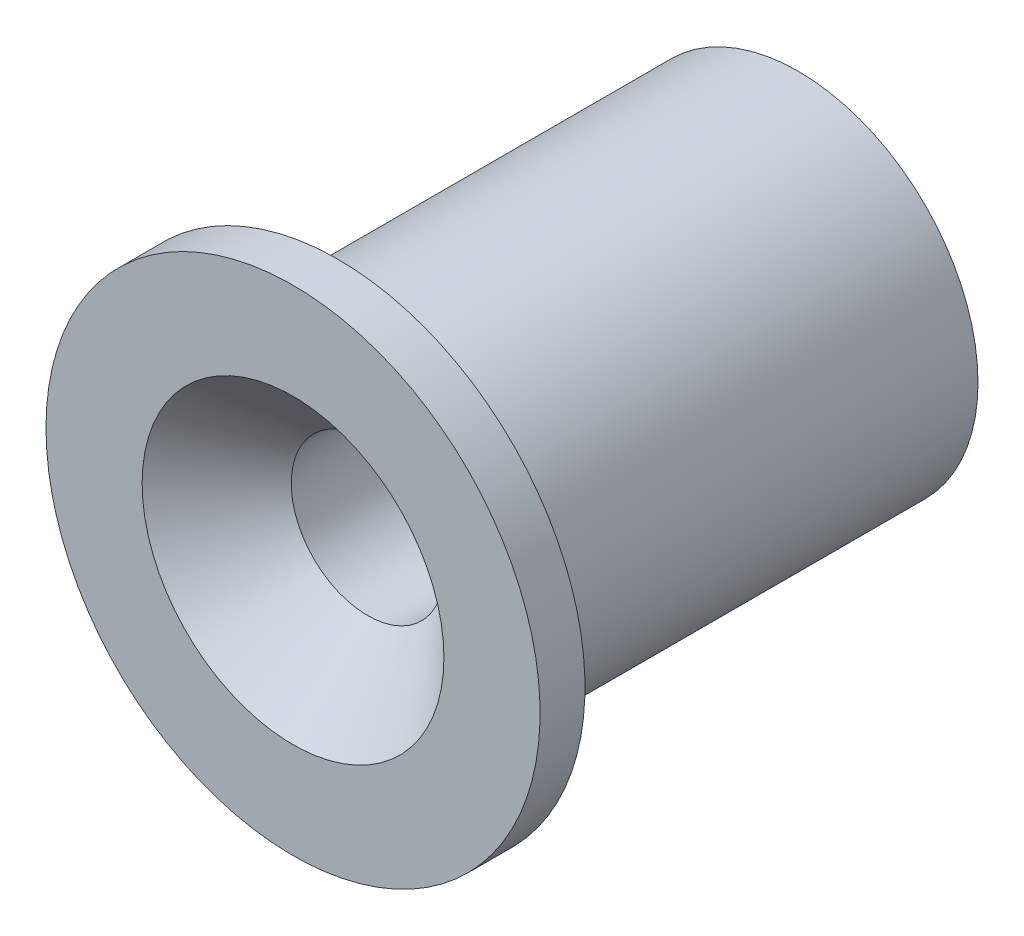
ISO-10303-21;
HEADER;
FILE_DESCRIPTION(('STEP AP214'),'2;1');
FILE_NAME('part.step','',(''),(''),'','','');
FILE_SCHEMA(('AUTOMOTIVE_DESIGN { 1 0 10303 214 1 1 1 1 }'));
ENDSEC;
DATA;
#1=APPLICATION_CONTEXT('core data for automotive mechanical design processes');
#2=APPLICATION_PROTOCOL_DEFINITION('international standard','automotive_design',2000,#1);
#3=PRODUCT_CONTEXT('',#1,'mechanical');
#4=PRODUCT('Part','Part','',(#3));
#5=PRODUCT_RELATED_PRODUCT_CATEGORY('part','',(#4));
#6=PRODUCT_DEFINITION_FORMATION('','',#4);
#7=PRODUCT_DEFINITION_CONTEXT('part definition',#1,'design');
#8=PRODUCT_DEFINITION('design','',#6,#7);
#9=PRODUCT_DEFINITION_SHAPE('','',#8);
#10=(LENGTH_UNIT() NAMED_UNIT(*) SI_UNIT(.MILLI.,.METRE.));
#11=(NAMED_UNIT(*) PLANE_ANGLE_UNIT() SI_UNIT($,.RADIAN.));
#12=(NAMED_UNIT(*) SI_UNIT($,.STERADIAN.) SOLID_ANGLE_UNIT());
#13=UNCERTAINTY_MEASURE_WITH_UNIT(LENGTH_MEASURE(1.E-05),#10,'distance_accuracy_value','');
#14=(GEOMETRIC_REPRESENTATION_CONTEXT(3) GLOBAL_UNCERTAINTY_ASSIGNED_CONTEXT((#13)) GLOBAL_UNIT_ASSIGNED_CONTEXT((#10,
#11,#12)) REPRESENTATION_CONTEXT('',''));
#15=CARTESIAN_POINT('',(0.,0.,0.));
#16=DIRECTION('',(0.,0.,1.));
#17=DIRECTION('',(1.,0.,0.));
#18=AXIS2_PLACEMENT_3D('',#15,#16,#17);
#19=CARTESIAN_POINT('',(-4.,0.,-11.25));
#20=DIRECTION('',(0.,0.,-1.));
#21=DIRECTION('',(-1.,0.,0.));
#22=AXIS2_PLACEMENT_3D('',#19,#20,#21);
#23=PLANE('',#22);
#24=CARTESIAN_POINT('',(0.,0.,-11.25));
#25=DIRECTION('',(0.,0.,1.));
#26=DIRECTION('',(1.,0.,0.));
#27=AXIS2_PLACEMENT_3D('',#24,#25,#26);
#28=CIRCLE('',#27,1.7);
#29=CARTESIAN_POINT('',(1.7,0.,-11.25));
#30=VERTEX_POINT('',#29);
#31=EDGE_CURVE('E49',#30,#30,#28,.T.);
#32=ORIENTED_EDGE('',*,*,#31,.T.);
#33=EDGE_LOOP('',(#32));
#34=FACE_BOUND('',#33,.T.);
#35=CARTESIAN_POINT('',(0.,0.,-11.25));
#36=DIRECTION('',(0.,0.,-1.));
#37=DIRECTION('',(-1.,0.,0.));
#38=AXIS2_PLACEMENT_3D('',#35,#36,#37);
#39=CIRCLE('',#38,4.);
#40=CARTESIAN_POINT('',(-4.,0.,-11.25));
#41=VERTEX_POINT('',#40);
#42=EDGE_CURVE('E44',#41,#41,#39,.T.);
#43=ORIENTED_EDGE('',*,*,#42,.T.);
#44=EDGE_LOOP('',(#43));
#45=FACE_BOUND('',#44,.T.);
#46=ADVANCED_FACE('F30',(#34,#45),#23,.T.);
#47=CARTESIAN_POINT('',(-1.5,0.,0.));
#48=DIRECTION('',(0.,0.,1.));
#49=DIRECTION('',(1.,0.,0.));
#50=AXIS2_PLACEMENT_3D('',#47,#48,#49);
#51=PLANE('',#50);
#52=CARTESIAN_POINT('',(0.,0.,0.));
#53=DIRECTION('',(0.,0.,1.));
#54=DIRECTION('',(1.,0.,0.));
#55=AXIS2_PLACEMENT_3D('',#52,#53,#54);
#56=CIRCLE('',#55,3.36);
#57=CARTESIAN_POINT('',(3.36,0.,0.));
#58=VERTEX_POINT('',#57);
#59=EDGE_CURVE('E55',#58,#58,#56,.T.);
#60=ORIENTED_EDGE('',*,*,#59,.F.);
#61=EDGE_LOOP('',(#60));
#62=FACE_BOUND('',#61,.T.);
#63=CARTESIAN_POINT('',(0.,0.,0.));
#64=DIRECTION('',(0.,0.,-1.));
#65=DIRECTION('',(-1.,0.,0.));
#66=AXIS2_PLACEMENT_3D('',#63,#64,#65);
#67=CIRCLE('',#66,5.5);
#68=CARTESIAN_POINT('',(-5.5,0.,0.));
#69=VERTEX_POINT('',#68);
#70=EDGE_CURVE('E10',#69,#69,#67,.T.);
#71=ORIENTED_EDGE('',*,*,#70,.F.);
#72=EDGE_LOOP('',(#71));
#73=FACE_BOUND('',#72,.T.);
#74=ADVANCED_FACE('F61',(#62,#73),#51,.T.);
#75=CARTESIAN_POINT('',(0.,0.,-19.1421319796954));
#76=DIRECTION('',(0.,0.,-1.));
#77=DIRECTION('',(-1.,0.,0.));
#78=AXIS2_PLACEMENT_3D('',#75,#76,#77);
#79=CYLINDRICAL_SURFACE('',#78,5.5);
#80=ORIENTED_EDGE('',*,*,#70,.T.);
#81=EDGE_LOOP('',(#80));
#82=FACE_BOUND('',#81,.T.);
#83=CARTESIAN_POINT('',(0.,0.,-1.));
#84=DIRECTION('',(0.,0.,-1.));
#85=DIRECTION('',(-1.,0.,0.));
#86=AXIS2_PLACEMENT_3D('',#83,#84,#85);
#87=CIRCLE('',#86,5.5);
#88=CARTESIAN_POINT('',(-5.5,0.,-1.));
#89=VERTEX_POINT('',#88);
#90=EDGE_CURVE('E36',#89,#89,#87,.T.);
#91=ORIENTED_EDGE('',*,*,#90,.F.);
#92=EDGE_LOOP('',(#91));
#93=FACE_BOUND('',#92,.T.);
#94=ADVANCED_FACE('F64',(#82,#93),#79,.T.);
#95=CARTESIAN_POINT('',(-5.5,0.,-1.));
#96=DIRECTION('',(0.,0.,-1.));
#97=DIRECTION('',(-1.,0.,0.));
#98=AXIS2_PLACEMENT_3D('',#95,#96,#97);
#99=PLANE('',#98);
#100=ORIENTED_EDGE('',*,*,#90,.T.);
#101=EDGE_LOOP('',(#100));
#102=FACE_BOUND('',#101,.T.);
#103=CARTESIAN_POINT('',(0.,0.,-1.));
#104=DIRECTION('',(0.,0.,-1.));
#105=DIRECTION('',(-1.,0.,0.));
#106=AXIS2_PLACEMENT_3D('',#103,#104,#105);
#107=CIRCLE('',#106,4.);
#108=CARTESIAN_POINT('',(-4.,0.,-1.));
#109=VERTEX_POINT('',#108);
#110=EDGE_CURVE('E40',#109,#109,#107,.T.);
#111=ORIENTED_EDGE('',*,*,#110,.F.);
#112=EDGE_LOOP('',(#111));
#113=FACE_BOUND('',#112,.T.);
#114=ADVANCED_FACE('F69',(#102,#113),#99,.T.);
#115=CARTESIAN_POINT('',(0.,0.,-19.1421319796954));
#116=DIRECTION('',(0.,0.,-1.));
#117=DIRECTION('',(-1.,0.,0.));
#118=AXIS2_PLACEMENT_3D('',#115,#116,#117);
#119=CYLINDRICAL_SURFACE('',#118,4.);
#120=ORIENTED_EDGE('',*,*,#110,.T.);
#121=EDGE_LOOP('',(#120));
#122=FACE_BOUND('',#121,.T.);
#123=ORIENTED_EDGE('',*,*,#42,.F.);
#124=EDGE_LOOP('',(#123));
#125=FACE_BOUND('',#124,.T.);
#126=ADVANCED_FACE('F75',(#122,#125),#119,.T.);
#127=CARTESIAN_POINT('',(0.,0.,0.));
#128=DIRECTION('',(0.,0.,1.));
#129=DIRECTION('',(1.,0.,0.));
#130=AXIS2_PLACEMENT_3D('',#127,#128,#129);
#131=CYLINDRICAL_SURFACE('',#130,1.7);
#132=ORIENTED_EDGE('',*,*,#31,.F.);
#133=EDGE_LOOP('',(#132));
#134=FACE_BOUND('',#133,.T.);
#135=CARTESIAN_POINT('',(0.,0.,-1.66000000000001));
#136=DIRECTION('',(0.,0.,1.));
#137=DIRECTION('',(1.,0.,0.));
#138=AXIS2_PLACEMENT_3D('',#135,#136,#137);
#139=CIRCLE('',#138,1.7);
#140=CARTESIAN_POINT('',(1.7,0.,-1.66000000000001));
#141=VERTEX_POINT('',#140);
#142=EDGE_CURVE('E52',#141,#141,#139,.T.);
#143=ORIENTED_EDGE('',*,*,#142,.T.);
#144=EDGE_LOOP('',(#143));
#145=FACE_BOUND('',#144,.T.);
#146=ADVANCED_FACE('F78',(#134,#145),#131,.F.);
#147=CARTESIAN_POINT('',(0.,0.,0.));
#148=DIRECTION('',(0.,0.,1.));
#149=DIRECTION('',(1.,0.,0.));
#150=AXIS2_PLACEMENT_3D('',#147,#148,#149);
#151=CONICAL_SURFACE('',#150,3.36,0.785398163397447);
#152=ORIENTED_EDGE('',*,*,#142,.F.);
#153=EDGE_LOOP('',(#152));
#154=FACE_BOUND('',#153,.T.);
#155=ORIENTED_EDGE('',*,*,#59,.T.);
#156=EDGE_LOOP('',(#155));
#157=FACE_BOUND('',#156,.T.);
#158=ADVANCED_FACE('F59',(#154,#157),#151,.F.);
#159=CLOSED_SHELL('',(#46,#74,#94,#114,#126,#146,#158));
#160=MANIFOLD_SOLID_BREP('B2',#159);
#161=ADVANCED_BREP_SHAPE_REPRESENTATION('',(#18,#160),#14);
#162=SHAPE_DEFINITION_REPRESENTATION(#9,#161);
ENDSEC;
END-ISO-10303-21;
